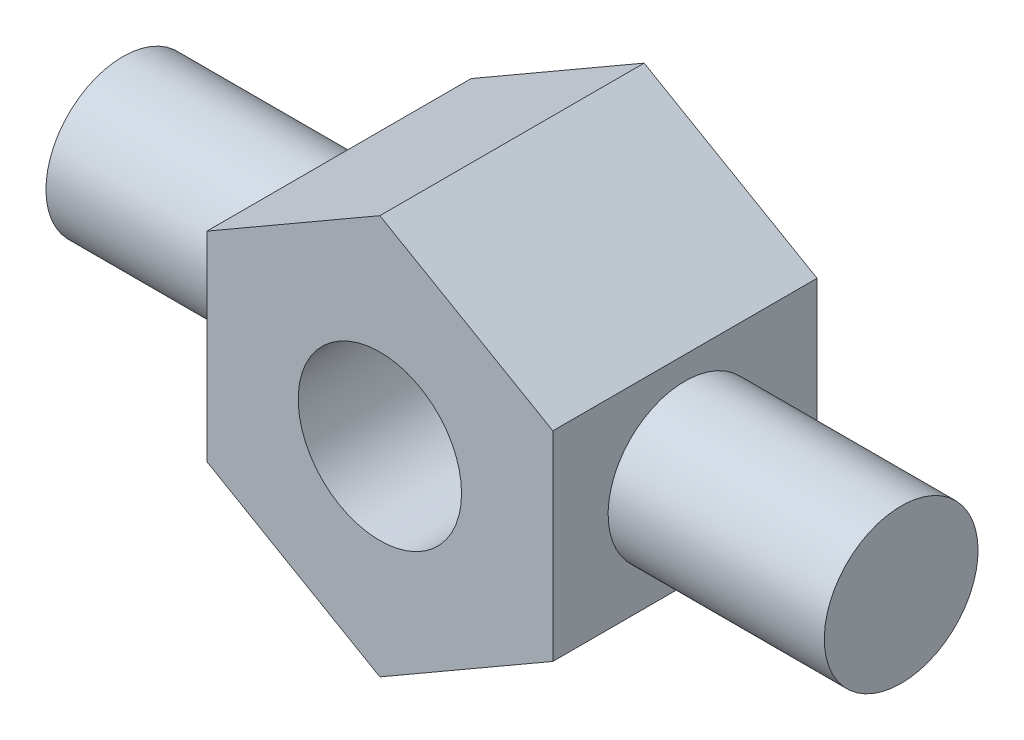
ISO-10303-21;
HEADER;
FILE_DESCRIPTION(('STEP AP214'),'2;1');
FILE_NAME('part.step','',(''),(''),'','','');
FILE_SCHEMA(('AUTOMOTIVE_DESIGN { 1 0 10303 214 1 1 1 1 }'));
ENDSEC;
DATA;
#1=APPLICATION_CONTEXT('core data for automotive mechanical design processes');
#2=APPLICATION_PROTOCOL_DEFINITION('international standard','automotive_design',2000,#1);
#3=PRODUCT_CONTEXT('',#1,'mechanical');
#4=PRODUCT('Part','Part','',(#3));
#5=PRODUCT_RELATED_PRODUCT_CATEGORY('part','',(#4));
#6=PRODUCT_DEFINITION_FORMATION('','',#4);
#7=PRODUCT_DEFINITION_CONTEXT('part definition',#1,'design');
#8=PRODUCT_DEFINITION('design','',#6,#7);
#9=PRODUCT_DEFINITION_SHAPE('','',#8);
#10=(LENGTH_UNIT() NAMED_UNIT(*) SI_UNIT(.MILLI.,.METRE.));
#11=(NAMED_UNIT(*) PLANE_ANGLE_UNIT() SI_UNIT($,.RADIAN.));
#12=(NAMED_UNIT(*) SI_UNIT($,.STERADIAN.) SOLID_ANGLE_UNIT());
#13=UNCERTAINTY_MEASURE_WITH_UNIT(LENGTH_MEASURE(1.E-05),#10,'distance_accuracy_value','');
#14=(GEOMETRIC_REPRESENTATION_CONTEXT(3) GLOBAL_UNCERTAINTY_ASSIGNED_CONTEXT((#13)) GLOBAL_UNIT_ASSIGNED_CONTEXT((#10,
#11,#12)) REPRESENTATION_CONTEXT('',''));
#15=CARTESIAN_POINT('',(0.,0.,0.));
#16=DIRECTION('',(0.,0.,1.));
#17=DIRECTION('',(1.,0.,0.));
#18=AXIS2_PLACEMENT_3D('',#15,#16,#17);
#19=CARTESIAN_POINT('',(0.,0.,27.5));
#20=DIRECTION('',(0.,0.,1.));
#21=DIRECTION('',(1.,0.,0.));
#22=AXIS2_PLACEMENT_3D('',#19,#20,#21);
#23=PLANE('',#22);
#24=DIRECTION('',(-0.866025403784441,0.499999999999995,0.));
#25=VECTOR('',#24,1.);
#26=CARTESIAN_POINT('',(17.9999999999999,10.3923048454135,27.5));
#27=LINE('',#26,#25);
#28=CARTESIAN_POINT('',(17.9999999999999,10.3923048454135,27.5));
#29=VERTEX_POINT('',#28);
#30=CARTESIAN_POINT('',(0.,20.7846096908265,27.5));
#31=VERTEX_POINT('',#30);
#32=EDGE_CURVE('E133',#29,#31,#27,.T.);
#33=ORIENTED_EDGE('',*,*,#32,.T.);
#34=DIRECTION('',(-0.866025403784438,-0.500000000000001,0.));
#35=VECTOR('',#34,1.);
#36=CARTESIAN_POINT('',(0.,20.7846096908265,27.5));
#37=LINE('',#36,#35);
#38=CARTESIAN_POINT('',(-18.,10.3923048454132,27.5));
#39=VERTEX_POINT('',#38);
#40=EDGE_CURVE('E91',#31,#39,#37,.T.);
#41=ORIENTED_EDGE('',*,*,#40,.T.);
#42=DIRECTION('',(0.,-1.,0.));
#43=VECTOR('',#42,1.);
#44=CARTESIAN_POINT('',(-18.,10.3923048454132,27.5));
#45=LINE('',#44,#43);
#46=CARTESIAN_POINT('',(-18.,-10.3923048454134,27.5));
#47=VERTEX_POINT('',#46);
#48=EDGE_CURVE('E104',#39,#47,#45,.T.);
#49=ORIENTED_EDGE('',*,*,#48,.T.);
#50=DIRECTION('',(0.866025403784441,-0.499999999999995,0.));
#51=VECTOR('',#50,1.);
#52=CARTESIAN_POINT('',(-18.,-10.3923048454134,27.5));
#53=LINE('',#52,#51);
#54=CARTESIAN_POINT('',(1.45138153741318E-13,-20.7846096908265,27.5));
#55=VERTEX_POINT('',#54);
#56=EDGE_CURVE('E98',#47,#55,#53,.T.);
#57=ORIENTED_EDGE('',*,*,#56,.T.);
#58=DIRECTION('',(0.866025403784435,0.500000000000007,0.));
#59=VECTOR('',#58,1.);
#60=CARTESIAN_POINT('',(1.45138153741318E-13,-20.7846096908265,27.5));
#61=LINE('',#60,#59);
#62=CARTESIAN_POINT('',(18.0000000000001,-10.3923048454131,27.5));
#63=VERTEX_POINT('',#62);
#64=EDGE_CURVE('E102',#55,#63,#61,.T.);
#65=ORIENTED_EDGE('',*,*,#64,.T.);
#66=DIRECTION('',(0.,1.,0.));
#67=VECTOR('',#66,1.);
#68=CARTESIAN_POINT('',(18.0000000000001,-10.3923048454131,27.5));
#69=LINE('',#68,#67);
#70=EDGE_CURVE('E53',#63,#29,#69,.T.);
#71=ORIENTED_EDGE('',*,*,#70,.T.);
#72=EDGE_LOOP('',(#33,#41,#49,#57,#65,#71));
#73=FACE_BOUND('',#72,.T.);
#74=CARTESIAN_POINT('',(0.,0.,27.5));
#75=DIRECTION('',(0.,0.,1.));
#76=DIRECTION('',(1.,0.,0.));
#77=AXIS2_PLACEMENT_3D('',#74,#75,#76);
#78=CIRCLE('',#77,8.5);
#79=CARTESIAN_POINT('',(8.5,0.,27.5));
#80=VERTEX_POINT('',#79);
#81=EDGE_CURVE('E126',#80,#80,#78,.T.);
#82=ORIENTED_EDGE('',*,*,#81,.F.);
#83=EDGE_LOOP('',(#82));
#84=FACE_BOUND('',#83,.T.);
#85=ADVANCED_FACE('F35',(#73,#84),#23,.T.);
#86=CARTESIAN_POINT('',(0.,0.,0.));
#87=DIRECTION('',(0.,0.,1.));
#88=DIRECTION('',(1.,0.,0.));
#89=AXIS2_PLACEMENT_3D('',#86,#87,#88);
#90=PLANE('',#89);
#91=DIRECTION('',(-0.866025403784441,0.499999999999995,0.));
#92=VECTOR('',#91,1.);
#93=CARTESIAN_POINT('',(17.9999999999999,10.3923048454135,0.));
#94=LINE('',#93,#92);
#95=CARTESIAN_POINT('',(17.9999999999999,10.3923048454135,0.));
#96=VERTEX_POINT('',#95);
#97=CARTESIAN_POINT('',(0.,20.7846096908265,0.));
#98=VERTEX_POINT('',#97);
#99=EDGE_CURVE('E122',#96,#98,#94,.T.);
#100=ORIENTED_EDGE('',*,*,#99,.F.);
#101=DIRECTION('',(0.,1.,0.));
#102=VECTOR('',#101,1.);
#103=CARTESIAN_POINT('',(18.0000000000001,-10.3923048454131,0.));
#104=LINE('',#103,#102);
#105=CARTESIAN_POINT('',(18.0000000000001,-10.3923048454131,0.));
#106=VERTEX_POINT('',#105);
#107=EDGE_CURVE('E82',#106,#96,#104,.T.);
#108=ORIENTED_EDGE('',*,*,#107,.F.);
#109=DIRECTION('',(0.866025403784435,0.500000000000007,0.));
#110=VECTOR('',#109,1.);
#111=CARTESIAN_POINT('',(1.45138153741318E-13,-20.7846096908265,0.));
#112=LINE('',#111,#110);
#113=CARTESIAN_POINT('',(1.45138153741318E-13,-20.7846096908265,0.));
#114=VERTEX_POINT('',#113);
#115=EDGE_CURVE('E76',#114,#106,#112,.T.);
#116=ORIENTED_EDGE('',*,*,#115,.F.);
#117=DIRECTION('',(0.866025403784441,-0.499999999999995,0.));
#118=VECTOR('',#117,1.);
#119=CARTESIAN_POINT('',(-18.,-10.3923048454134,0.));
#120=LINE('',#119,#118);
#121=CARTESIAN_POINT('',(-18.,-10.3923048454134,0.));
#122=VERTEX_POINT('',#121);
#123=EDGE_CURVE('E112',#122,#114,#120,.T.);
#124=ORIENTED_EDGE('',*,*,#123,.F.);
#125=DIRECTION('',(0.,-1.,0.));
#126=VECTOR('',#125,1.);
#127=CARTESIAN_POINT('',(-18.,10.3923048454132,0.));
#128=LINE('',#127,#126);
#129=CARTESIAN_POINT('',(-18.,10.3923048454132,0.));
#130=VERTEX_POINT('',#129);
#131=EDGE_CURVE('E128',#130,#122,#128,.T.);
#132=ORIENTED_EDGE('',*,*,#131,.F.);
#133=DIRECTION('',(-0.866025403784438,-0.500000000000001,0.));
#134=VECTOR('',#133,1.);
#135=CARTESIAN_POINT('',(0.,20.7846096908265,0.));
#136=LINE('',#135,#134);
#137=EDGE_CURVE('E125',#98,#130,#136,.T.);
#138=ORIENTED_EDGE('',*,*,#137,.F.);
#139=EDGE_LOOP('',(#100,#108,#116,#124,#132,#138));
#140=FACE_BOUND('',#139,.T.);
#141=CARTESIAN_POINT('',(0.,0.,0.));
#142=DIRECTION('',(0.,0.,1.));
#143=DIRECTION('',(1.,0.,0.));
#144=AXIS2_PLACEMENT_3D('',#141,#142,#143);
#145=CIRCLE('',#144,8.5);
#146=CARTESIAN_POINT('',(8.5,0.,0.));
#147=VERTEX_POINT('',#146);
#148=EDGE_CURVE('E152',#147,#147,#145,.T.);
#149=ORIENTED_EDGE('',*,*,#148,.T.);
#150=EDGE_LOOP('',(#149));
#151=FACE_BOUND('',#150,.T.);
#152=ADVANCED_FACE('F146',(#140,#151),#90,.F.);
#153=CARTESIAN_POINT('',(17.9999999999999,10.3923048454135,27.5));
#154=DIRECTION('',(-0.499999999999995,-0.866025403784441,0.));
#155=DIRECTION('',(0.866025403784442,-0.499999999999995,0.));
#156=AXIS2_PLACEMENT_3D('',#153,#154,#155);
#157=PLANE('',#156);
#158=ORIENTED_EDGE('',*,*,#99,.T.);
#159=DIRECTION('',(0.,0.,-1.));
#160=VECTOR('',#159,1.);
#161=CARTESIAN_POINT('',(0.,20.7846096908265,27.5));
#162=LINE('',#161,#160);
#163=EDGE_CURVE('E39',#31,#98,#162,.T.);
#164=ORIENTED_EDGE('',*,*,#163,.F.);
#165=ORIENTED_EDGE('',*,*,#32,.F.);
#166=DIRECTION('',(0.,0.,-1.));
#167=VECTOR('',#166,1.);
#168=CARTESIAN_POINT('',(17.9999999999999,10.3923048454135,27.5));
#169=LINE('',#168,#167);
#170=EDGE_CURVE('E118',#29,#96,#169,.T.);
#171=ORIENTED_EDGE('',*,*,#170,.T.);
#172=EDGE_LOOP('',(#158,#164,#165,#171));
#173=FACE_BOUND('',#172,.T.);
#174=ADVANCED_FACE('F37',(#173),#157,.F.);
#175=CARTESIAN_POINT('',(0.,20.7846096908265,27.5));
#176=DIRECTION('',(0.500000000000001,-0.866025403784438,0.));
#177=DIRECTION('',(0.866025403784438,0.500000000000001,0.));
#178=AXIS2_PLACEMENT_3D('',#175,#176,#177);
#179=PLANE('',#178);
#180=ORIENTED_EDGE('',*,*,#137,.T.);
#181=DIRECTION('',(0.,0.,-1.));
#182=VECTOR('',#181,1.);
#183=CARTESIAN_POINT('',(-18.,10.3923048454132,27.5));
#184=LINE('',#183,#182);
#185=EDGE_CURVE('E136',#39,#130,#184,.T.);
#186=ORIENTED_EDGE('',*,*,#185,.F.);
#187=ORIENTED_EDGE('',*,*,#40,.F.);
#188=ORIENTED_EDGE('',*,*,#163,.T.);
#189=EDGE_LOOP('',(#180,#186,#187,#188));
#190=FACE_BOUND('',#189,.T.);
#191=ADVANCED_FACE('F141',(#190),#179,.F.);
#192=CARTESIAN_POINT('',(-18.,10.3923048454132,27.5));
#193=DIRECTION('',(1.,0.,0.));
#194=DIRECTION('',(0.,1.,0.));
#195=AXIS2_PLACEMENT_3D('',#192,#193,#194);
#196=PLANE('',#195);
#197=CARTESIAN_POINT('',(-18.,1.88021733719384E-13,13.75));
#198=DIRECTION('',(1.,0.,0.));
#199=DIRECTION('',(0.,1.,0.));
#200=AXIS2_PLACEMENT_3D('',#197,#198,#199);
#201=CIRCLE('',#200,8.);
#202=CARTESIAN_POINT('',(-17.9999999999999,8.00000000000019,13.75));
#203=VERTEX_POINT('',#202);
#204=EDGE_CURVE('E161',#203,#203,#201,.T.);
#205=ORIENTED_EDGE('',*,*,#204,.T.);
#206=EDGE_LOOP('',(#205));
#207=FACE_BOUND('',#206,.T.);
#208=ORIENTED_EDGE('',*,*,#131,.T.);
#209=DIRECTION('',(0.,0.,-1.));
#210=VECTOR('',#209,1.);
#211=CARTESIAN_POINT('',(-18.,-10.3923048454134,27.5));
#212=LINE('',#211,#210);
#213=EDGE_CURVE('E113',#47,#122,#212,.T.);
#214=ORIENTED_EDGE('',*,*,#213,.F.);
#215=ORIENTED_EDGE('',*,*,#48,.F.);
#216=ORIENTED_EDGE('',*,*,#185,.T.);
#217=EDGE_LOOP('',(#208,#214,#215,#216));
#218=FACE_BOUND('',#217,.T.);
#219=ADVANCED_FACE('F148',(#207,#218),#196,.F.);
#220=CARTESIAN_POINT('',(-18.,-10.3923048454134,27.5));
#221=DIRECTION('',(0.499999999999995,0.866025403784441,0.));
#222=DIRECTION('',(-0.866025403784442,0.499999999999995,0.));
#223=AXIS2_PLACEMENT_3D('',#220,#221,#222);
#224=PLANE('',#223);
#225=ORIENTED_EDGE('',*,*,#123,.T.);
#226=DIRECTION('',(0.,0.,-1.));
#227=VECTOR('',#226,1.);
#228=CARTESIAN_POINT('',(1.45138153741318E-13,-20.7846096908265,27.5));
#229=LINE('',#228,#227);
#230=EDGE_CURVE('E109',#55,#114,#229,.T.);
#231=ORIENTED_EDGE('',*,*,#230,.F.);
#232=ORIENTED_EDGE('',*,*,#56,.F.);
#233=ORIENTED_EDGE('',*,*,#213,.T.);
#234=EDGE_LOOP('',(#225,#231,#232,#233));
#235=FACE_BOUND('',#234,.T.);
#236=ADVANCED_FACE('F110',(#235),#224,.F.);
#237=CARTESIAN_POINT('',(1.45138153741318E-13,-20.7846096908265,27.5));
#238=DIRECTION('',(-0.500000000000007,0.866025403784435,0.));
#239=DIRECTION('',(-0.866025403784434,-0.500000000000007,0.));
#240=AXIS2_PLACEMENT_3D('',#237,#238,#239);
#241=PLANE('',#240);
#242=ORIENTED_EDGE('',*,*,#115,.T.);
#243=DIRECTION('',(0.,0.,-1.));
#244=VECTOR('',#243,1.);
#245=CARTESIAN_POINT('',(18.0000000000001,-10.3923048454131,27.5));
#246=LINE('',#245,#244);
#247=EDGE_CURVE('E114',#63,#106,#246,.T.);
#248=ORIENTED_EDGE('',*,*,#247,.F.);
#249=ORIENTED_EDGE('',*,*,#64,.F.);
#250=ORIENTED_EDGE('',*,*,#230,.T.);
#251=EDGE_LOOP('',(#242,#248,#249,#250));
#252=FACE_BOUND('',#251,.T.);
#253=ADVANCED_FACE('F116',(#252),#241,.F.);
#254=CARTESIAN_POINT('',(18.0000000000001,-10.3923048454131,27.5));
#255=DIRECTION('',(-1.,0.,0.));
#256=DIRECTION('',(0.,-1.,0.));
#257=AXIS2_PLACEMENT_3D('',#254,#255,#256);
#258=PLANE('',#257);
#259=CARTESIAN_POINT('',(18.,1.88021733719384E-13,13.75));
#260=DIRECTION('',(1.,0.,0.));
#261=DIRECTION('',(0.,1.,0.));
#262=AXIS2_PLACEMENT_3D('',#259,#260,#261);
#263=CIRCLE('',#262,8.);
#264=CARTESIAN_POINT('',(18.0000000000001,-7.99999999999981,13.75));
#265=VERTEX_POINT('',#264);
#266=EDGE_CURVE('E11',#265,#265,#263,.T.);
#267=ORIENTED_EDGE('',*,*,#266,.F.);
#268=EDGE_LOOP('',(#267));
#269=FACE_BOUND('',#268,.T.);
#270=ORIENTED_EDGE('',*,*,#107,.T.);
#271=ORIENTED_EDGE('',*,*,#170,.F.);
#272=ORIENTED_EDGE('',*,*,#70,.F.);
#273=ORIENTED_EDGE('',*,*,#247,.T.);
#274=EDGE_LOOP('',(#270,#271,#272,#273));
#275=FACE_BOUND('',#274,.T.);
#276=ADVANCED_FACE('F188',(#269,#275),#258,.F.);
#277=CARTESIAN_POINT('',(0.,0.,27.5));
#278=DIRECTION('',(0.,0.,-1.));
#279=DIRECTION('',(-1.,0.,0.));
#280=AXIS2_PLACEMENT_3D('',#277,#278,#279);
#281=CYLINDRICAL_SURFACE('',#280,8.5);
#282=ORIENTED_EDGE('',*,*,#81,.T.);
#283=EDGE_LOOP('',(#282));
#284=FACE_BOUND('',#283,.T.);
#285=ORIENTED_EDGE('',*,*,#148,.F.);
#286=EDGE_LOOP('',(#285));
#287=FACE_BOUND('',#286,.T.);
#288=ADVANCED_FACE('F185',(#284,#287),#281,.F.);
#289=CARTESIAN_POINT('',(40.5,4.20880496523643E-13,13.75));
#290=DIRECTION('',(-1.,0.,0.));
#291=DIRECTION('',(0.,-1.,0.));
#292=AXIS2_PLACEMENT_3D('',#289,#290,#291);
#293=CYLINDRICAL_SURFACE('',#292,8.);
#294=CARTESIAN_POINT('',(40.5,4.20880496523643E-13,13.75));
#295=DIRECTION('',(1.,0.,0.));
#296=DIRECTION('',(0.,1.,0.));
#297=AXIS2_PLACEMENT_3D('',#294,#295,#296);
#298=CIRCLE('',#297,8.);
#299=CARTESIAN_POINT('',(40.5000000000001,-7.99999999999958,13.75));
#300=VERTEX_POINT('',#299);
#301=EDGE_CURVE('E155',#300,#300,#298,.T.);
#302=CARTESIAN_POINT('',(40.5000000000001,-7.99999999999958,13.75));
#303=CARTESIAN_POINT('',(40.2656250000001,-7.99999999999958,13.75));
#304=CARTESIAN_POINT('',(40.0312500000001,-7.99999999999958,13.75));
#305=CARTESIAN_POINT('',(39.5625000000001,-7.99999999999959,13.75));
#306=CARTESIAN_POINT('',(39.3281250000001,-7.99999999999959,13.75));
#307=CARTESIAN_POINT('',(38.8593750000001,-7.9999999999996,13.75));
#308=CARTESIAN_POINT('',(38.6250000000001,-7.9999999999996,13.75));
#309=CARTESIAN_POINT('',(38.1562500000001,-7.9999999999996,13.75));
#310=CARTESIAN_POINT('',(37.9218750000001,-7.99999999999961,13.75));
#311=CARTESIAN_POINT('',(37.4531250000001,-7.99999999999961,13.75));
#312=CARTESIAN_POINT('',(37.2187500000001,-7.99999999999961,13.75));
#313=CARTESIAN_POINT('',(36.7500000000001,-7.99999999999962,13.75));
#314=CARTESIAN_POINT('',(36.5156250000001,-7.99999999999962,13.75));
#315=CARTESIAN_POINT('',(36.0468750000001,-7.99999999999962,13.75));
#316=CARTESIAN_POINT('',(35.8125000000001,-7.99999999999963,13.75));
#317=CARTESIAN_POINT('',(35.3437500000001,-7.99999999999963,13.75));
#318=CARTESIAN_POINT('',(35.1093750000001,-7.99999999999963,13.75));
#319=CARTESIAN_POINT('',(34.6406250000001,-7.99999999999964,13.75));
#320=CARTESIAN_POINT('',(34.4062500000001,-7.99999999999964,13.75));
#321=CARTESIAN_POINT('',(33.9375000000001,-7.99999999999965,13.75));
#322=CARTESIAN_POINT('',(33.7031250000001,-7.99999999999965,13.75));
#323=CARTESIAN_POINT('',(33.2343750000001,-7.99999999999965,13.75));
#324=CARTESIAN_POINT('',(33.0000000000001,-7.99999999999966,13.75));
#325=CARTESIAN_POINT('',(32.5312500000001,-7.99999999999966,13.75));
#326=CARTESIAN_POINT('',(32.2968750000001,-7.99999999999966,13.75));
#327=CARTESIAN_POINT('',(31.8281250000001,-7.99999999999967,13.75));
#328=CARTESIAN_POINT('',(31.5937500000001,-7.99999999999967,13.75));
#329=CARTESIAN_POINT('',(31.1250000000001,-7.99999999999968,13.75));
#330=CARTESIAN_POINT('',(30.8906250000001,-7.99999999999968,13.75));
#331=CARTESIAN_POINT('',(30.4218750000001,-7.99999999999968,13.75));
#332=CARTESIAN_POINT('',(30.1875000000001,-7.99999999999969,13.75));
#333=CARTESIAN_POINT('',(29.7187500000001,-7.99999999999969,13.75));
#334=CARTESIAN_POINT('',(29.4843750000001,-7.99999999999969,13.75));
#335=CARTESIAN_POINT('',(29.0156250000001,-7.9999999999997,13.75));
#336=CARTESIAN_POINT('',(28.7812500000001,-7.9999999999997,13.75));
#337=CARTESIAN_POINT('',(28.3125000000001,-7.99999999999971,13.75));
#338=CARTESIAN_POINT('',(28.0781250000001,-7.99999999999971,13.75));
#339=CARTESIAN_POINT('',(27.6093750000001,-7.99999999999971,13.75));
#340=CARTESIAN_POINT('',(27.3750000000001,-7.99999999999972,13.75));
#341=CARTESIAN_POINT('',(26.9062500000001,-7.99999999999972,13.75));
#342=CARTESIAN_POINT('',(26.6718750000001,-7.99999999999972,13.75));
#343=CARTESIAN_POINT('',(26.2031250000001,-7.99999999999973,13.75));
#344=CARTESIAN_POINT('',(25.9687500000001,-7.99999999999973,13.75));
#345=CARTESIAN_POINT('',(25.5000000000001,-7.99999999999973,13.75));
#346=CARTESIAN_POINT('',(25.2656250000001,-7.99999999999974,13.75));
#347=CARTESIAN_POINT('',(24.7968750000001,-7.99999999999974,13.75));
#348=CARTESIAN_POINT('',(24.5625000000001,-7.99999999999974,13.75));
#349=CARTESIAN_POINT('',(24.0937500000001,-7.99999999999975,13.75));
#350=CARTESIAN_POINT('',(23.8593750000001,-7.99999999999975,13.75));
#351=CARTESIAN_POINT('',(23.3906250000001,-7.99999999999976,13.75));
#352=CARTESIAN_POINT('',(23.1562500000001,-7.99999999999976,13.75));
#353=CARTESIAN_POINT('',(22.6875000000001,-7.99999999999976,13.75));
#354=CARTESIAN_POINT('',(22.4531250000001,-7.99999999999977,13.75));
#355=CARTESIAN_POINT('',(21.9843750000001,-7.99999999999977,13.75));
#356=CARTESIAN_POINT('',(21.7500000000001,-7.99999999999977,13.75));
#357=CARTESIAN_POINT('',(21.2812500000001,-7.99999999999978,13.75));
#358=CARTESIAN_POINT('',(21.0468750000001,-7.99999999999978,13.75));
#359=CARTESIAN_POINT('',(20.5781250000001,-7.99999999999979,13.75));
#360=CARTESIAN_POINT('',(20.3437500000001,-7.99999999999979,13.75));
#361=CARTESIAN_POINT('',(19.8750000000001,-7.99999999999979,13.75));
#362=CARTESIAN_POINT('',(19.6406250000001,-7.9999999999998,13.75));
#363=CARTESIAN_POINT('',(19.1718750000001,-7.9999999999998,13.75));
#364=CARTESIAN_POINT('',(18.9375000000001,-7.9999999999998,13.75));
#365=CARTESIAN_POINT('',(18.4687500000001,-7.99999999999981,13.75));
#366=CARTESIAN_POINT('',(18.2343750000001,-7.99999999999981,13.75));
#367=CARTESIAN_POINT('',(18.0000000000001,-7.99999999999981,13.75));
#368=B_SPLINE_CURVE_WITH_KNOTS('',3,(#302,#303,#304,#305,#306,#307,#308,#309,#310,#311,#312,
#313,#314,#315,#316,#317,#318,#319,#320,#321,#322,#323,#324,#325,#326,#327,#328,#329,#330,#331,
#332,#333,#334,#335,#336,#337,#338,#339,#340,#341,#342,#343,#344,#345,#346,#347,#348,#349,#350,
#351,#352,#353,#354,#355,#356,#357,#358,#359,#360,#361,#362,#363,#364,#365,#366,#367),
.UNSPECIFIED.,.F.,.F.,(4,2,2,2,2,2,2,2,2,2,2,2,2,2,2,2,2,2,2,2,2,2,2,2,2,2,2,2,2,2,2,2,4),(0.,
0.703124999999999,1.40625,2.109375,2.8125,3.51562499999999,4.21874999999999,4.92187499999999,
5.625,6.328125,7.03125,7.73437499999999,8.43749999999999,9.14062499999999,9.84374999999999,
10.546875,11.25,11.953125,12.65625,13.359375,14.0625,14.765625,15.46875,16.171875,16.875,
17.578125,18.28125,18.984375,19.6875,20.390625,21.09375,21.796875,22.5),.UNSPECIFIED.);
#369=EDGE_CURVE('BSEAM251',#300,#265,#368,.T.);
#370=ORIENTED_EDGE('',*,*,#301,.F.);
#371=ORIENTED_EDGE('',*,*,#266,.T.);
#372=ORIENTED_EDGE('',*,*,#369,.T.);
#373=ORIENTED_EDGE('',*,*,#369,.F.);
#374=EDGE_LOOP('',(#370,#372,#371,#373));
#375=FACE_BOUND('',#374,.T.);
#376=ADVANCED_FACE('F251',(#375),#293,.T.);
#377=CARTESIAN_POINT('',(40.5,4.20880496523643E-13,13.75));
#378=DIRECTION('',(1.,0.,0.));
#379=DIRECTION('',(0.,1.,0.));
#380=AXIS2_PLACEMENT_3D('',#377,#378,#379);
#381=PLANE('',#380);
#382=ORIENTED_EDGE('',*,*,#301,.T.);
#383=EDGE_LOOP('',(#382));
#384=FACE_BOUND('',#383,.T.);
#385=ADVANCED_FACE('F176',(#384),#381,.T.);
#386=CARTESIAN_POINT('',(-40.5,4.20880496523643E-13,13.75));
#387=DIRECTION('',(1.,0.,0.));
#388=DIRECTION('',(0.,1.,0.));
#389=AXIS2_PLACEMENT_3D('',#386,#387,#388);
#390=CYLINDRICAL_SURFACE('',#389,8.);
#391=CARTESIAN_POINT('',(-40.5,4.20880496523643E-13,13.75));
#392=DIRECTION('',(1.,0.,0.));
#393=DIRECTION('',(0.,1.,0.));
#394=AXIS2_PLACEMENT_3D('',#391,#392,#393);
#395=CIRCLE('',#394,8.);
#396=CARTESIAN_POINT('',(-40.4999999999999,8.00000000000042,13.75));
#397=VERTEX_POINT('',#396);
#398=EDGE_CURVE('E160',#397,#397,#395,.T.);
#399=CARTESIAN_POINT('',(-40.4999999999999,8.00000000000042,13.75));
#400=CARTESIAN_POINT('',(-40.2656249999999,8.00000000000042,13.75));
#401=CARTESIAN_POINT('',(-40.0312499999999,8.00000000000042,13.75));
#402=CARTESIAN_POINT('',(-39.5624999999999,8.00000000000041,13.75));
#403=CARTESIAN_POINT('',(-39.3281249999999,8.00000000000041,13.75));
#404=CARTESIAN_POINT('',(-38.8593749999999,8.00000000000041,13.75));
#405=CARTESIAN_POINT('',(-38.6249999999999,8.0000000000004,13.75));
#406=CARTESIAN_POINT('',(-38.1562499999999,8.0000000000004,13.75));
#407=CARTESIAN_POINT('',(-37.9218749999999,8.00000000000039,13.75));
#408=CARTESIAN_POINT('',(-37.4531249999999,8.00000000000039,13.75));
#409=CARTESIAN_POINT('',(-37.2187499999999,8.00000000000039,13.75));
#410=CARTESIAN_POINT('',(-36.7499999999999,8.00000000000038,13.75));
#411=CARTESIAN_POINT('',(-36.5156249999999,8.00000000000038,13.75));
#412=CARTESIAN_POINT('',(-36.0468749999999,8.00000000000038,13.75));
#413=CARTESIAN_POINT('',(-35.8124999999999,8.00000000000037,13.75));
#414=CARTESIAN_POINT('',(-35.3437499999999,8.00000000000037,13.75));
#415=CARTESIAN_POINT('',(-35.1093749999999,8.00000000000037,13.75));
#416=CARTESIAN_POINT('',(-34.6406249999999,8.00000000000036,13.75));
#417=CARTESIAN_POINT('',(-34.4062499999999,8.00000000000036,13.75));
#418=CARTESIAN_POINT('',(-33.9374999999999,8.00000000000035,13.75));
#419=CARTESIAN_POINT('',(-33.7031249999999,8.00000000000035,13.75));
#420=CARTESIAN_POINT('',(-33.2343749999999,8.00000000000035,13.75));
#421=CARTESIAN_POINT('',(-32.9999999999999,8.00000000000034,13.75));
#422=CARTESIAN_POINT('',(-32.5312499999999,8.00000000000034,13.75));
#423=CARTESIAN_POINT('',(-32.2968749999999,8.00000000000034,13.75));
#424=CARTESIAN_POINT('',(-31.8281249999999,8.00000000000033,13.75));
#425=CARTESIAN_POINT('',(-31.5937499999999,8.00000000000033,13.75));
#426=CARTESIAN_POINT('',(-31.1249999999999,8.00000000000032,13.75));
#427=CARTESIAN_POINT('',(-30.8906249999999,8.00000000000032,13.75));
#428=CARTESIAN_POINT('',(-30.4218749999999,8.00000000000032,13.75));
#429=CARTESIAN_POINT('',(-30.1874999999999,8.00000000000031,13.75));
#430=CARTESIAN_POINT('',(-29.7187499999999,8.00000000000031,13.75));
#431=CARTESIAN_POINT('',(-29.4843749999999,8.00000000000031,13.75));
#432=CARTESIAN_POINT('',(-29.0156249999999,8.0000000000003,13.75));
#433=CARTESIAN_POINT('',(-28.7812499999999,8.0000000000003,13.75));
#434=CARTESIAN_POINT('',(-28.3124999999999,8.00000000000029,13.75));
#435=CARTESIAN_POINT('',(-28.0781249999999,8.00000000000029,13.75));
#436=CARTESIAN_POINT('',(-27.6093749999999,8.00000000000029,13.75));
#437=CARTESIAN_POINT('',(-27.3749999999999,8.00000000000028,13.75));
#438=CARTESIAN_POINT('',(-26.9062499999999,8.00000000000028,13.75));
#439=CARTESIAN_POINT('',(-26.6718749999999,8.00000000000028,13.75));
#440=CARTESIAN_POINT('',(-26.2031249999999,8.00000000000027,13.75));
#441=CARTESIAN_POINT('',(-25.9687499999999,8.00000000000027,13.75));
#442=CARTESIAN_POINT('',(-25.4999999999999,8.00000000000027,13.75));
#443=CARTESIAN_POINT('',(-25.2656249999999,8.00000000000026,13.75));
#444=CARTESIAN_POINT('',(-24.7968749999999,8.00000000000026,13.75));
#445=CARTESIAN_POINT('',(-24.5624999999999,8.00000000000026,13.75));
#446=CARTESIAN_POINT('',(-24.0937499999999,8.00000000000025,13.75));
#447=CARTESIAN_POINT('',(-23.8593749999999,8.00000000000025,13.75));
#448=CARTESIAN_POINT('',(-23.3906249999999,8.00000000000024,13.75));
#449=CARTESIAN_POINT('',(-23.1562499999999,8.00000000000024,13.75));
#450=CARTESIAN_POINT('',(-22.6874999999999,8.00000000000024,13.75));
#451=CARTESIAN_POINT('',(-22.4531249999999,8.00000000000023,13.75));
#452=CARTESIAN_POINT('',(-21.9843749999999,8.00000000000023,13.75));
#453=CARTESIAN_POINT('',(-21.7499999999999,8.00000000000023,13.75));
#454=CARTESIAN_POINT('',(-21.2812499999999,8.00000000000022,13.75));
#455=CARTESIAN_POINT('',(-21.0468749999999,8.00000000000022,13.75));
#456=CARTESIAN_POINT('',(-20.5781249999999,8.00000000000021,13.75));
#457=CARTESIAN_POINT('',(-20.3437499999999,8.00000000000021,13.75));
#458=CARTESIAN_POINT('',(-19.8749999999999,8.00000000000021,13.75));
#459=CARTESIAN_POINT('',(-19.6406249999999,8.0000000000002,13.75));
#460=CARTESIAN_POINT('',(-19.1718749999999,8.0000000000002,13.75));
#461=CARTESIAN_POINT('',(-18.9374999999999,8.0000000000002,13.75));
#462=CARTESIAN_POINT('',(-18.4687499999999,8.00000000000019,13.75));
#463=CARTESIAN_POINT('',(-18.2343749999999,8.00000000000019,13.75));
#464=CARTESIAN_POINT('',(-17.9999999999999,8.00000000000019,13.75));
#465=B_SPLINE_CURVE_WITH_KNOTS('',3,(#399,#400,#401,#402,#403,#404,#405,#406,#407,#408,#409,
#410,#411,#412,#413,#414,#415,#416,#417,#418,#419,#420,#421,#422,#423,#424,#425,#426,#427,#428,
#429,#430,#431,#432,#433,#434,#435,#436,#437,#438,#439,#440,#441,#442,#443,#444,#445,#446,#447,
#448,#449,#450,#451,#452,#453,#454,#455,#456,#457,#458,#459,#460,#461,#462,#463,#464),
.UNSPECIFIED.,.F.,.F.,(4,2,2,2,2,2,2,2,2,2,2,2,2,2,2,2,2,2,2,2,2,2,2,2,2,2,2,2,2,2,2,2,4),(0.,
0.703124999999999,1.40625,2.109375,2.8125,3.51562499999999,4.21874999999999,4.921875,5.625,
6.328125,7.03125,7.73437499999999,8.43749999999999,9.140625,9.84375,10.546875,11.25,11.953125,
12.65625,13.359375,14.0625,14.765625,15.46875,16.171875,16.875,17.578125,18.28125,18.984375,
19.6875,20.390625,21.09375,21.796875,22.5),.UNSPECIFIED.);
#466=EDGE_CURVE('BSEAM167',#397,#203,#465,.T.);
#467=ORIENTED_EDGE('',*,*,#398,.T.);
#468=ORIENTED_EDGE('',*,*,#204,.F.);
#469=ORIENTED_EDGE('',*,*,#466,.T.);
#470=ORIENTED_EDGE('',*,*,#466,.F.);
#471=EDGE_LOOP('',(#467,#469,#468,#470));
#472=FACE_BOUND('',#471,.T.);
#473=ADVANCED_FACE('F167',(#472),#390,.T.);
#474=CARTESIAN_POINT('',(-40.5,4.20880496523643E-13,13.75));
#475=DIRECTION('',(-1.,0.,0.));
#476=DIRECTION('',(0.,1.,0.));
#477=AXIS2_PLACEMENT_3D('',#474,#475,#476);
#478=PLANE('',#477);
#479=ORIENTED_EDGE('',*,*,#398,.F.);
#480=EDGE_LOOP('',(#479));
#481=FACE_BOUND('',#480,.T.);
#482=ADVANCED_FACE('F170',(#481),#478,.T.);
#483=CLOSED_SHELL('',(#85,#152,#174,#191,#219,#236,#253,#276,#288,#376,#385,#473,#482));
#484=MANIFOLD_SOLID_BREP('B2',#483);
#485=ADVANCED_BREP_SHAPE_REPRESENTATION('',(#18,#484),#14);
#486=SHAPE_DEFINITION_REPRESENTATION(#9,#485);
ENDSEC;
END-ISO-10303-21;
